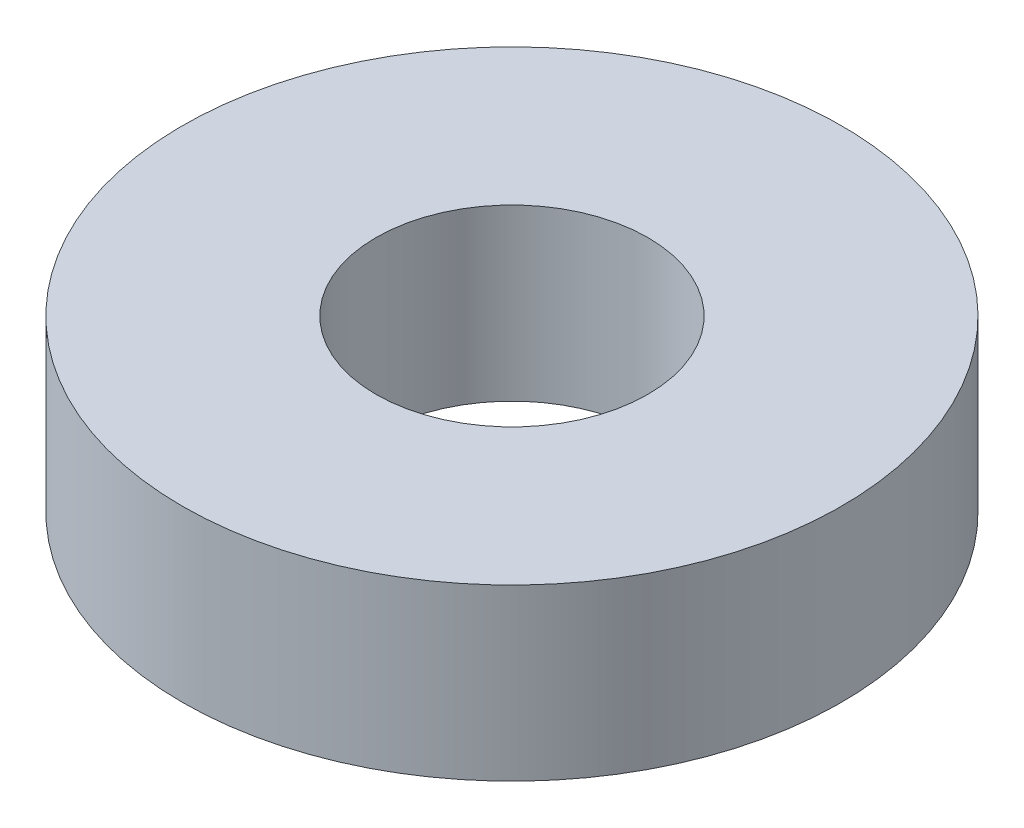
ISO-10303-21;
HEADER;
FILE_DESCRIPTION(('STEP AP214'),'2;1');
FILE_NAME('part.step','',(''),(''),'','','');
FILE_SCHEMA(('AUTOMOTIVE_DESIGN { 1 0 10303 214 1 1 1 1 }'));
ENDSEC;
DATA;
#1=APPLICATION_CONTEXT('core data for automotive mechanical design processes');
#2=APPLICATION_PROTOCOL_DEFINITION('international standard','automotive_design',2000,#1);
#3=PRODUCT_CONTEXT('',#1,'mechanical');
#4=PRODUCT('Part','Part','',(#3));
#5=PRODUCT_RELATED_PRODUCT_CATEGORY('part','',(#4));
#6=PRODUCT_DEFINITION_FORMATION('','',#4);
#7=PRODUCT_DEFINITION_CONTEXT('part definition',#1,'design');
#8=PRODUCT_DEFINITION('design','',#6,#7);
#9=PRODUCT_DEFINITION_SHAPE('','',#8);
#10=(LENGTH_UNIT() NAMED_UNIT(*) SI_UNIT(.MILLI.,.METRE.));
#11=(NAMED_UNIT(*) PLANE_ANGLE_UNIT() SI_UNIT($,.RADIAN.));
#12=(NAMED_UNIT(*) SI_UNIT($,.STERADIAN.) SOLID_ANGLE_UNIT());
#13=UNCERTAINTY_MEASURE_WITH_UNIT(LENGTH_MEASURE(1.E-05),#10,'distance_accuracy_value','');
#14=(GEOMETRIC_REPRESENTATION_CONTEXT(3) GLOBAL_UNCERTAINTY_ASSIGNED_CONTEXT((#13)) GLOBAL_UNIT_ASSIGNED_CONTEXT((#10,
#11,#12)) REPRESENTATION_CONTEXT('',''));
#15=CARTESIAN_POINT('',(0.,0.,0.));
#16=DIRECTION('',(0.,0.,1.));
#17=DIRECTION('',(1.,0.,0.));
#18=AXIS2_PLACEMENT_3D('',#15,#16,#17);
#19=CARTESIAN_POINT('',(0.,5.,0.));
#20=DIRECTION('',(0.,1.,0.));
#21=DIRECTION('',(0.,0.,1.));
#22=AXIS2_PLACEMENT_3D('',#19,#20,#21);
#23=PLANE('',#22);
#24=CARTESIAN_POINT('',(0.,5.,0.));
#25=DIRECTION('',(0.,1.,0.));
#26=DIRECTION('',(0.,0.,1.));
#27=AXIS2_PLACEMENT_3D('',#24,#25,#26);
#28=CIRCLE('',#27,9.7);
#29=CARTESIAN_POINT('',(0.,5.,9.7));
#30=VERTEX_POINT('',#29);
#31=EDGE_CURVE('E10',#30,#30,#28,.T.);
#32=ORIENTED_EDGE('',*,*,#31,.T.);
#33=EDGE_LOOP('',(#32));
#34=FACE_BOUND('',#33,.T.);
#35=CARTESIAN_POINT('',(0.,5.,0.));
#36=DIRECTION('',(0.,1.,0.));
#37=DIRECTION('',(0.,0.,1.));
#38=AXIS2_PLACEMENT_3D('',#35,#36,#37);
#39=CIRCLE('',#38,4.);
#40=CARTESIAN_POINT('',(0.,5.,4.));
#41=VERTEX_POINT('',#40);
#42=EDGE_CURVE('E43',#41,#41,#39,.T.);
#43=ORIENTED_EDGE('',*,*,#42,.F.);
#44=EDGE_LOOP('',(#43));
#45=FACE_BOUND('',#44,.T.);
#46=ADVANCED_FACE('F32',(#34,#45),#23,.T.);
#47=CARTESIAN_POINT('',(0.,0.,0.));
#48=DIRECTION('',(0.,1.,0.));
#49=DIRECTION('',(0.,0.,1.));
#50=AXIS2_PLACEMENT_3D('',#47,#48,#49);
#51=PLANE('',#50);
#52=CARTESIAN_POINT('',(0.,0.,0.));
#53=DIRECTION('',(0.,1.,0.));
#54=DIRECTION('',(0.,0.,1.));
#55=AXIS2_PLACEMENT_3D('',#52,#53,#54);
#56=CIRCLE('',#55,9.7);
#57=CARTESIAN_POINT('',(0.,0.,9.7));
#58=VERTEX_POINT('',#57);
#59=EDGE_CURVE('E36',#58,#58,#56,.T.);
#60=ORIENTED_EDGE('',*,*,#59,.F.);
#61=EDGE_LOOP('',(#60));
#62=FACE_BOUND('',#61,.T.);
#63=CARTESIAN_POINT('',(0.,0.,0.));
#64=DIRECTION('',(0.,1.,0.));
#65=DIRECTION('',(0.,0.,1.));
#66=AXIS2_PLACEMENT_3D('',#63,#64,#65);
#67=CIRCLE('',#66,4.);
#68=CARTESIAN_POINT('',(0.,0.,4.));
#69=VERTEX_POINT('',#68);
#70=EDGE_CURVE('E45',#69,#69,#67,.T.);
#71=ORIENTED_EDGE('',*,*,#70,.T.);
#72=EDGE_LOOP('',(#71));
#73=FACE_BOUND('',#72,.T.);
#74=ADVANCED_FACE('F55',(#62,#73),#51,.F.);
#75=CARTESIAN_POINT('',(0.,5.,0.));
#76=DIRECTION('',(0.,-1.,0.));
#77=DIRECTION('',(0.,0.,-1.));
#78=AXIS2_PLACEMENT_3D('',#75,#76,#77);
#79=CYLINDRICAL_SURFACE('',#78,9.7);
#80=ORIENTED_EDGE('',*,*,#31,.F.);
#81=EDGE_LOOP('',(#80));
#82=FACE_BOUND('',#81,.T.);
#83=ORIENTED_EDGE('',*,*,#59,.T.);
#84=EDGE_LOOP('',(#83));
#85=FACE_BOUND('',#84,.T.);
#86=ADVANCED_FACE('F34',(#82,#85),#79,.T.);
#87=CARTESIAN_POINT('',(0.,5.,0.));
#88=DIRECTION('',(0.,-1.,0.));
#89=DIRECTION('',(0.,0.,-1.));
#90=AXIS2_PLACEMENT_3D('',#87,#88,#89);
#91=CYLINDRICAL_SURFACE('',#90,4.);
#92=ORIENTED_EDGE('',*,*,#42,.T.);
#93=EDGE_LOOP('',(#92));
#94=FACE_BOUND('',#93,.T.);
#95=ORIENTED_EDGE('',*,*,#70,.F.);
#96=EDGE_LOOP('',(#95));
#97=FACE_BOUND('',#96,.T.);
#98=ADVANCED_FACE('F51',(#94,#97),#91,.F.);
#99=CLOSED_SHELL('',(#46,#74,#86,#98));
#100=MANIFOLD_SOLID_BREP('B2',#99);
#101=ADVANCED_BREP_SHAPE_REPRESENTATION('',(#18,#100),#14);
#102=SHAPE_DEFINITION_REPRESENTATION(#9,#101);
ENDSEC;
END-ISO-10303-21;
